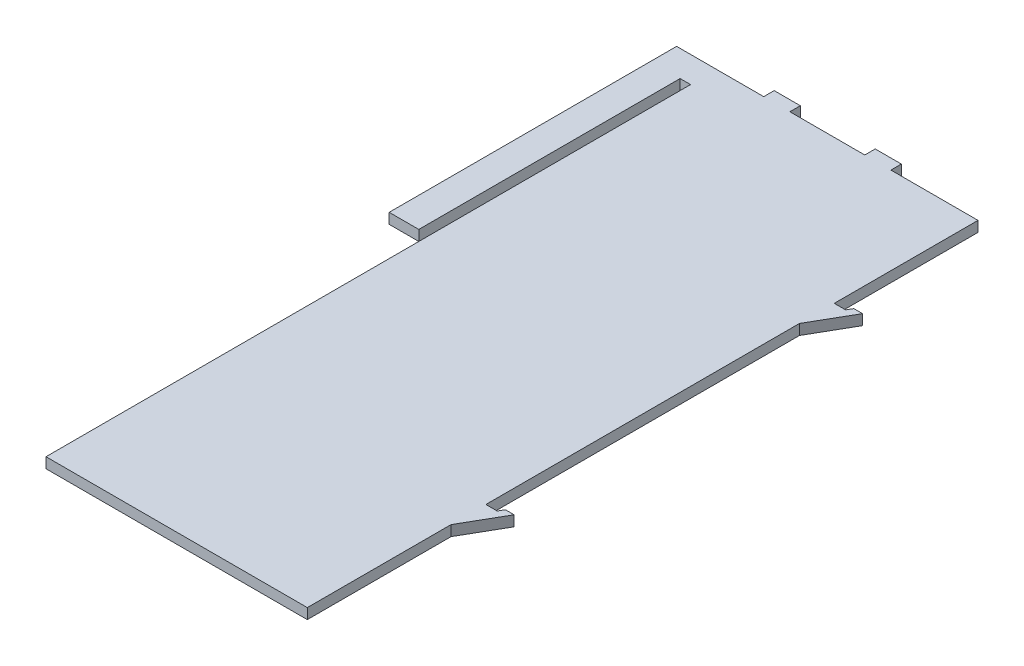
ISO-10303-21;
HEADER;
FILE_DESCRIPTION(('STEP AP214'),'2;1');
FILE_NAME('part.step','',(''),(''),'','','');
FILE_SCHEMA(('AUTOMOTIVE_DESIGN { 1 0 10303 214 1 1 1 1 }'));
ENDSEC;
DATA;
#1=APPLICATION_CONTEXT('core data for automotive mechanical design processes');
#2=APPLICATION_PROTOCOL_DEFINITION('international standard','automotive_design',2000,#1);
#3=PRODUCT_CONTEXT('',#1,'mechanical');
#4=PRODUCT('Part','Part','',(#3));
#5=PRODUCT_RELATED_PRODUCT_CATEGORY('part','',(#4));
#6=PRODUCT_DEFINITION_FORMATION('','',#4);
#7=PRODUCT_DEFINITION_CONTEXT('part definition',#1,'design');
#8=PRODUCT_DEFINITION('design','',#6,#7);
#9=PRODUCT_DEFINITION_SHAPE('','',#8);
#10=(LENGTH_UNIT() NAMED_UNIT(*) SI_UNIT(.MILLI.,.METRE.));
#11=(NAMED_UNIT(*) PLANE_ANGLE_UNIT() SI_UNIT($,.RADIAN.));
#12=(NAMED_UNIT(*) SI_UNIT($,.STERADIAN.) SOLID_ANGLE_UNIT());
#13=UNCERTAINTY_MEASURE_WITH_UNIT(LENGTH_MEASURE(1.E-05),#10,'distance_accuracy_value','');
#14=(GEOMETRIC_REPRESENTATION_CONTEXT(3) GLOBAL_UNCERTAINTY_ASSIGNED_CONTEXT((#13)) GLOBAL_UNIT_ASSIGNED_CONTEXT((#10,
#11,#12)) REPRESENTATION_CONTEXT('',''));
#15=CARTESIAN_POINT('',(0.,0.,0.));
#16=DIRECTION('',(0.,0.,1.));
#17=DIRECTION('',(1.,0.,0.));
#18=AXIS2_PLACEMENT_3D('',#15,#16,#17);
#19=CARTESIAN_POINT('',(0.,6.,0.));
#20=DIRECTION('',(0.,0.,-1.));
#21=DIRECTION('',(-1.,0.,0.));
#22=AXIS2_PLACEMENT_3D('',#19,#20,#21);
#23=PLANE('',#22);
#24=DIRECTION('',(1.,0.,0.));
#25=VECTOR('',#24,1.);
#26=CARTESIAN_POINT('',(0.,0.,0.));
#27=LINE('',#26,#25);
#28=CARTESIAN_POINT('',(0.,0.,0.));
#29=VERTEX_POINT('',#28);
#30=CARTESIAN_POINT('',(17.,0.,0.));
#31=VERTEX_POINT('',#30);
#32=EDGE_CURVE('E254',#29,#31,#27,.T.);
#33=ORIENTED_EDGE('',*,*,#32,.T.);
#34=DIRECTION('',(0.,-1.,0.));
#35=VECTOR('',#34,1.);
#36=CARTESIAN_POINT('',(17.,6.,0.));
#37=LINE('',#36,#35);
#38=CARTESIAN_POINT('',(17.,6.,0.));
#39=VERTEX_POINT('',#38);
#40=EDGE_CURVE('E11',#39,#31,#37,.T.);
#41=ORIENTED_EDGE('',*,*,#40,.F.);
#42=DIRECTION('',(1.,0.,0.));
#43=VECTOR('',#42,1.);
#44=CARTESIAN_POINT('',(0.,6.,0.));
#45=LINE('',#44,#43);
#46=CARTESIAN_POINT('',(0.,6.,0.));
#47=VERTEX_POINT('',#46);
#48=EDGE_CURVE('E330',#47,#39,#45,.T.);
#49=ORIENTED_EDGE('',*,*,#48,.F.);
#50=DIRECTION('',(0.,-1.,0.));
#51=VECTOR('',#50,1.);
#52=CARTESIAN_POINT('',(0.,6.,0.));
#53=LINE('',#52,#51);
#54=EDGE_CURVE('E250',#47,#29,#53,.T.);
#55=ORIENTED_EDGE('',*,*,#54,.T.);
#56=EDGE_LOOP('',(#33,#41,#49,#55));
#57=FACE_BOUND('',#56,.T.);
#58=ADVANCED_FACE('F45',(#57),#23,.F.);
#59=CARTESIAN_POINT('',(17.,6.,0.));
#60=DIRECTION('',(-1.,0.,0.));
#61=DIRECTION('',(0.,0.,1.));
#62=AXIS2_PLACEMENT_3D('',#59,#60,#61);
#63=PLANE('',#62);
#64=DIRECTION('',(0.,0.,-1.));
#65=VECTOR('',#64,1.);
#66=CARTESIAN_POINT('',(17.,0.,0.));
#67=LINE('',#66,#65);
#68=CARTESIAN_POINT('',(17.,0.,-150.));
#69=VERTEX_POINT('',#68);
#70=EDGE_CURVE('E258',#31,#69,#67,.T.);
#71=ORIENTED_EDGE('',*,*,#70,.T.);
#72=DIRECTION('',(0.,-1.,0.));
#73=VECTOR('',#72,1.);
#74=CARTESIAN_POINT('',(17.,6.,-150.));
#75=LINE('',#74,#73);
#76=CARTESIAN_POINT('',(17.,6.,-150.));
#77=VERTEX_POINT('',#76);
#78=EDGE_CURVE('E54',#77,#69,#75,.T.);
#79=ORIENTED_EDGE('',*,*,#78,.F.);
#80=DIRECTION('',(0.,0.,-1.));
#81=VECTOR('',#80,1.);
#82=CARTESIAN_POINT('',(17.,6.,0.));
#83=LINE('',#82,#81);
#84=EDGE_CURVE('E159',#39,#77,#83,.T.);
#85=ORIENTED_EDGE('',*,*,#84,.F.);
#86=ORIENTED_EDGE('',*,*,#40,.T.);
#87=EDGE_LOOP('',(#71,#79,#85,#86));
#88=FACE_BOUND('',#87,.T.);
#89=ADVANCED_FACE('F522',(#88),#63,.F.);
#90=CARTESIAN_POINT('',(17.,6.,-150.));
#91=DIRECTION('',(0.,0.,-1.));
#92=DIRECTION('',(-1.,0.,0.));
#93=AXIS2_PLACEMENT_3D('',#90,#91,#92);
#94=PLANE('',#93);
#95=DIRECTION('',(1.,0.,0.));
#96=VECTOR('',#95,1.);
#97=CARTESIAN_POINT('',(17.,0.,-150.));
#98=LINE('',#97,#96);
#99=CARTESIAN_POINT('',(23.,0.,-150.));
#100=VERTEX_POINT('',#99);
#101=EDGE_CURVE('E261',#69,#100,#98,.T.);
#102=ORIENTED_EDGE('',*,*,#101,.T.);
#103=DIRECTION('',(0.,-1.,0.));
#104=VECTOR('',#103,1.);
#105=CARTESIAN_POINT('',(23.,6.,-150.));
#106=LINE('',#105,#104);
#107=CARTESIAN_POINT('',(23.,6.,-150.));
#108=VERTEX_POINT('',#107);
#109=EDGE_CURVE('E413',#108,#100,#106,.T.);
#110=ORIENTED_EDGE('',*,*,#109,.F.);
#111=DIRECTION('',(1.,0.,0.));
#112=VECTOR('',#111,1.);
#113=CARTESIAN_POINT('',(17.,6.,-150.));
#114=LINE('',#113,#112);
#115=EDGE_CURVE('E423',#77,#108,#114,.T.);
#116=ORIENTED_EDGE('',*,*,#115,.F.);
#117=ORIENTED_EDGE('',*,*,#78,.T.);
#118=EDGE_LOOP('',(#102,#110,#116,#117));
#119=FACE_BOUND('',#118,.T.);
#120=ADVANCED_FACE('F421',(#119),#94,.F.);
#121=CARTESIAN_POINT('',(23.,6.,-150.));
#122=DIRECTION('',(1.,0.,0.));
#123=DIRECTION('',(0.,0.,-1.));
#124=AXIS2_PLACEMENT_3D('',#121,#122,#123);
#125=PLANE('',#124);
#126=DIRECTION('',(0.,0.,1.));
#127=VECTOR('',#126,1.);
#128=CARTESIAN_POINT('',(23.,0.,-150.));
#129=LINE('',#128,#127);
#130=CARTESIAN_POINT('',(23.,0.,220.));
#131=VERTEX_POINT('',#130);
#132=EDGE_CURVE('E264',#100,#131,#129,.T.);
#133=ORIENTED_EDGE('',*,*,#132,.T.);
#134=DIRECTION('',(0.,-1.,0.));
#135=VECTOR('',#134,1.);
#136=CARTESIAN_POINT('',(23.,6.,220.));
#137=LINE('',#136,#135);
#138=CARTESIAN_POINT('',(23.,6.,220.));
#139=VERTEX_POINT('',#138);
#140=EDGE_CURVE('E409',#139,#131,#137,.T.);
#141=ORIENTED_EDGE('',*,*,#140,.F.);
#142=DIRECTION('',(0.,0.,1.));
#143=VECTOR('',#142,1.);
#144=CARTESIAN_POINT('',(23.,6.,-150.));
#145=LINE('',#144,#143);
#146=EDGE_CURVE('E442',#108,#139,#145,.T.);
#147=ORIENTED_EDGE('',*,*,#146,.F.);
#148=ORIENTED_EDGE('',*,*,#109,.T.);
#149=EDGE_LOOP('',(#133,#141,#147,#148));
#150=FACE_BOUND('',#149,.T.);
#151=ADVANCED_FACE('F432',(#150),#125,.F.);
#152=CARTESIAN_POINT('',(173.,6.,220.));
#153=DIRECTION('',(0.,0.,-1.));
#154=DIRECTION('',(-1.,0.,0.));
#155=AXIS2_PLACEMENT_3D('',#152,#153,#154);
#156=PLANE('',#155);
#157=DIRECTION('',(1.,0.,0.));
#158=VECTOR('',#157,1.);
#159=CARTESIAN_POINT('',(173.,0.,220.));
#160=LINE('',#159,#158);
#161=CARTESIAN_POINT('',(173.,0.,220.));
#162=VERTEX_POINT('',#161);
#163=EDGE_CURVE('E267',#131,#162,#160,.T.);
#164=ORIENTED_EDGE('',*,*,#163,.T.);
#165=DIRECTION('',(0.,-1.,0.));
#166=VECTOR('',#165,1.);
#167=CARTESIAN_POINT('',(173.,6.,220.));
#168=LINE('',#167,#166);
#169=CARTESIAN_POINT('',(173.,6.,220.));
#170=VERTEX_POINT('',#169);
#171=EDGE_CURVE('E405',#170,#162,#168,.T.);
#172=ORIENTED_EDGE('',*,*,#171,.F.);
#173=DIRECTION('',(1.,0.,0.));
#174=VECTOR('',#173,1.);
#175=CARTESIAN_POINT('',(173.,6.,220.));
#176=LINE('',#175,#174);
#177=EDGE_CURVE('E438',#139,#170,#176,.T.);
#178=ORIENTED_EDGE('',*,*,#177,.F.);
#179=ORIENTED_EDGE('',*,*,#140,.T.);
#180=EDGE_LOOP('',(#164,#172,#178,#179));
#181=FACE_BOUND('',#180,.T.);
#182=ADVANCED_FACE('F436',(#181),#156,.F.);
#183=CARTESIAN_POINT('',(173.,6.,137.499999999999));
#184=DIRECTION('',(-1.,0.,0.));
#185=DIRECTION('',(0.,0.,1.));
#186=AXIS2_PLACEMENT_3D('',#183,#184,#185);
#187=PLANE('',#186);
#188=DIRECTION('',(0.,0.,-1.));
#189=VECTOR('',#188,1.);
#190=CARTESIAN_POINT('',(173.,0.,137.499999999999));
#191=LINE('',#190,#189);
#192=CARTESIAN_POINT('',(173.,0.,137.499999999999));
#193=VERTEX_POINT('',#192);
#194=EDGE_CURVE('E270',#162,#193,#191,.T.);
#195=ORIENTED_EDGE('',*,*,#194,.T.);
#196=DIRECTION('',(0.,-1.,0.));
#197=VECTOR('',#196,1.);
#198=CARTESIAN_POINT('',(173.,6.,137.499999999999));
#199=LINE('',#198,#197);
#200=CARTESIAN_POINT('',(173.,6.,137.499999999999));
#201=VERTEX_POINT('',#200);
#202=EDGE_CURVE('E401',#201,#193,#199,.T.);
#203=ORIENTED_EDGE('',*,*,#202,.F.);
#204=DIRECTION('',(0.,0.,-1.));
#205=VECTOR('',#204,1.);
#206=CARTESIAN_POINT('',(173.,6.,137.499999999999));
#207=LINE('',#206,#205);
#208=EDGE_CURVE('E441',#170,#201,#207,.T.);
#209=ORIENTED_EDGE('',*,*,#208,.F.);
#210=ORIENTED_EDGE('',*,*,#171,.T.);
#211=EDGE_LOOP('',(#195,#203,#209,#210));
#212=FACE_BOUND('',#211,.T.);
#213=ADVANCED_FACE('F535',(#212),#187,.F.);
#214=CARTESIAN_POINT('',(186.225,6.,114.499999999999));
#215=DIRECTION('',(-0.866906303057535,0.,-0.498471124258084));
#216=DIRECTION('',(-0.498471124258084,0.,0.866906303057535));
#217=AXIS2_PLACEMENT_3D('',#214,#215,#216);
#218=PLANE('',#217);
#219=DIRECTION('',(0.498471124258084,0.,-0.866906303057535));
#220=VECTOR('',#219,1.);
#221=CARTESIAN_POINT('',(186.225,0.,114.499999999999));
#222=LINE('',#221,#220);
#223=CARTESIAN_POINT('',(186.225,0.,114.499999999999));
#224=VERTEX_POINT('',#223);
#225=EDGE_CURVE('E273',#193,#224,#222,.T.);
#226=ORIENTED_EDGE('',*,*,#225,.T.);
#227=DIRECTION('',(0.,-1.,0.));
#228=VECTOR('',#227,1.);
#229=CARTESIAN_POINT('',(186.225,6.,114.499999999999));
#230=LINE('',#229,#228);
#231=CARTESIAN_POINT('',(186.225,6.,114.499999999999));
#232=VERTEX_POINT('',#231);
#233=EDGE_CURVE('E397',#232,#224,#230,.T.);
#234=ORIENTED_EDGE('',*,*,#233,.F.);
#235=DIRECTION('',(0.498471124258084,0.,-0.866906303057535));
#236=VECTOR('',#235,1.);
#237=CARTESIAN_POINT('',(186.225,6.,114.499999999999));
#238=LINE('',#237,#236);
#239=EDGE_CURVE('E446',#201,#232,#238,.T.);
#240=ORIENTED_EDGE('',*,*,#239,.F.);
#241=ORIENTED_EDGE('',*,*,#202,.T.);
#242=EDGE_LOOP('',(#226,#234,#240,#241));
#243=FACE_BOUND('',#242,.T.);
#244=ADVANCED_FACE('F538',(#243),#218,.F.);
#245=CARTESIAN_POINT('',(181.225,6.,114.499999999999));
#246=DIRECTION('',(0.,0.,1.));
#247=DIRECTION('',(1.,0.,0.));
#248=AXIS2_PLACEMENT_3D('',#245,#246,#247);
#249=PLANE('',#248);
#250=DIRECTION('',(-1.,0.,0.));
#251=VECTOR('',#250,1.);
#252=CARTESIAN_POINT('',(181.225,0.,114.499999999999));
#253=LINE('',#252,#251);
#254=CARTESIAN_POINT('',(181.225,0.,114.499999999999));
#255=VERTEX_POINT('',#254);
#256=EDGE_CURVE('E276',#224,#255,#253,.T.);
#257=ORIENTED_EDGE('',*,*,#256,.T.);
#258=DIRECTION('',(0.,-1.,0.));
#259=VECTOR('',#258,1.);
#260=CARTESIAN_POINT('',(181.225,6.,114.499999999999));
#261=LINE('',#260,#259);
#262=CARTESIAN_POINT('',(181.225,6.,114.499999999999));
#263=VERTEX_POINT('',#262);
#264=EDGE_CURVE('E393',#263,#255,#261,.T.);
#265=ORIENTED_EDGE('',*,*,#264,.F.);
#266=DIRECTION('',(-1.,0.,0.));
#267=VECTOR('',#266,1.);
#268=CARTESIAN_POINT('',(181.225,6.,114.499999999999));
#269=LINE('',#268,#267);
#270=EDGE_CURVE('E453',#232,#263,#269,.T.);
#271=ORIENTED_EDGE('',*,*,#270,.F.);
#272=ORIENTED_EDGE('',*,*,#233,.T.);
#273=EDGE_LOOP('',(#257,#265,#271,#272));
#274=FACE_BOUND('',#273,.T.);
#275=ADVANCED_FACE('F542',(#274),#249,.F.);
#276=CARTESIAN_POINT('',(179.5,6.,117.499999999999));
#277=DIRECTION('',(0.866906303057531,0.,0.49847112425809));
#278=DIRECTION('',(0.49847112425809,0.,-0.866906303057531));
#279=AXIS2_PLACEMENT_3D('',#276,#277,#278);
#280=PLANE('',#279);
#281=DIRECTION('',(-0.49847112425809,0.,0.866906303057531));
#282=VECTOR('',#281,1.);
#283=CARTESIAN_POINT('',(179.5,0.,117.499999999999));
#284=LINE('',#283,#282);
#285=CARTESIAN_POINT('',(179.5,0.,117.499999999999));
#286=VERTEX_POINT('',#285);
#287=EDGE_CURVE('E279',#255,#286,#284,.T.);
#288=ORIENTED_EDGE('',*,*,#287,.T.);
#289=DIRECTION('',(0.,-1.,0.));
#290=VECTOR('',#289,1.);
#291=CARTESIAN_POINT('',(179.5,6.,117.499999999999));
#292=LINE('',#291,#290);
#293=CARTESIAN_POINT('',(179.5,6.,117.499999999999));
#294=VERTEX_POINT('',#293);
#295=EDGE_CURVE('E389',#294,#286,#292,.T.);
#296=ORIENTED_EDGE('',*,*,#295,.F.);
#297=DIRECTION('',(-0.49847112425809,0.,0.866906303057531));
#298=VECTOR('',#297,1.);
#299=CARTESIAN_POINT('',(179.5,6.,117.499999999999));
#300=LINE('',#299,#298);
#301=EDGE_CURVE('E456',#263,#294,#300,.T.);
#302=ORIENTED_EDGE('',*,*,#301,.F.);
#303=ORIENTED_EDGE('',*,*,#264,.T.);
#304=EDGE_LOOP('',(#288,#296,#302,#303));
#305=FACE_BOUND('',#304,.T.);
#306=ADVANCED_FACE('F546',(#305),#280,.F.);
#307=CARTESIAN_POINT('',(173.,6.,117.499999999999));
#308=DIRECTION('',(0.,0.,1.));
#309=DIRECTION('',(1.,0.,0.));
#310=AXIS2_PLACEMENT_3D('',#307,#308,#309);
#311=PLANE('',#310);
#312=DIRECTION('',(-1.,0.,0.));
#313=VECTOR('',#312,1.);
#314=CARTESIAN_POINT('',(173.,0.,117.499999999999));
#315=LINE('',#314,#313);
#316=CARTESIAN_POINT('',(173.,0.,117.499999999999));
#317=VERTEX_POINT('',#316);
#318=EDGE_CURVE('E282',#286,#317,#315,.T.);
#319=ORIENTED_EDGE('',*,*,#318,.T.);
#320=DIRECTION('',(0.,-1.,0.));
#321=VECTOR('',#320,1.);
#322=CARTESIAN_POINT('',(173.,6.,117.499999999999));
#323=LINE('',#322,#321);
#324=CARTESIAN_POINT('',(173.,6.,117.499999999999));
#325=VERTEX_POINT('',#324);
#326=EDGE_CURVE('E385',#325,#317,#323,.T.);
#327=ORIENTED_EDGE('',*,*,#326,.F.);
#328=DIRECTION('',(-1.,0.,0.));
#329=VECTOR('',#328,1.);
#330=CARTESIAN_POINT('',(173.,6.,117.499999999999));
#331=LINE('',#330,#329);
#332=EDGE_CURVE('E459',#294,#325,#331,.T.);
#333=ORIENTED_EDGE('',*,*,#332,.F.);
#334=ORIENTED_EDGE('',*,*,#295,.T.);
#335=EDGE_LOOP('',(#319,#327,#333,#334));
#336=FACE_BOUND('',#335,.T.);
#337=ADVANCED_FACE('F550',(#336),#311,.F.);
#338=CARTESIAN_POINT('',(173.,6.,-62.5000000000046));
#339=DIRECTION('',(-1.,0.,0.));
#340=DIRECTION('',(0.,0.,1.));
#341=AXIS2_PLACEMENT_3D('',#338,#339,#340);
#342=PLANE('',#341);
#343=DIRECTION('',(0.,0.,-1.));
#344=VECTOR('',#343,1.);
#345=CARTESIAN_POINT('',(173.,0.,-62.5000000000046));
#346=LINE('',#345,#344);
#347=CARTESIAN_POINT('',(173.,0.,-62.5000000000046));
#348=VERTEX_POINT('',#347);
#349=EDGE_CURVE('E285',#317,#348,#346,.T.);
#350=ORIENTED_EDGE('',*,*,#349,.T.);
#351=DIRECTION('',(0.,-1.,0.));
#352=VECTOR('',#351,1.);
#353=CARTESIAN_POINT('',(173.,6.,-62.5000000000046));
#354=LINE('',#353,#352);
#355=CARTESIAN_POINT('',(173.,6.,-62.5000000000046));
#356=VERTEX_POINT('',#355);
#357=EDGE_CURVE('E381',#356,#348,#354,.T.);
#358=ORIENTED_EDGE('',*,*,#357,.F.);
#359=DIRECTION('',(0.,0.,-1.));
#360=VECTOR('',#359,1.);
#361=CARTESIAN_POINT('',(173.,6.,-62.5000000000046));
#362=LINE('',#361,#360);
#363=EDGE_CURVE('E462',#325,#356,#362,.T.);
#364=ORIENTED_EDGE('',*,*,#363,.F.);
#365=ORIENTED_EDGE('',*,*,#326,.T.);
#366=EDGE_LOOP('',(#350,#358,#364,#365));
#367=FACE_BOUND('',#366,.T.);
#368=ADVANCED_FACE('F554',(#367),#342,.F.);
#369=CARTESIAN_POINT('',(186.225,6.,-85.5000000000007));
#370=DIRECTION('',(-0.866906303057494,0.,-0.498471124258155));
#371=DIRECTION('',(-0.498471124258155,0.,0.866906303057494));
#372=AXIS2_PLACEMENT_3D('',#369,#370,#371);
#373=PLANE('',#372);
#374=DIRECTION('',(0.498471124258155,0.,-0.866906303057494));
#375=VECTOR('',#374,1.);
#376=CARTESIAN_POINT('',(186.225,0.,-85.5000000000007));
#377=LINE('',#376,#375);
#378=CARTESIAN_POINT('',(186.225,0.,-85.5000000000007));
#379=VERTEX_POINT('',#378);
#380=EDGE_CURVE('E288',#348,#379,#377,.T.);
#381=ORIENTED_EDGE('',*,*,#380,.T.);
#382=DIRECTION('',(0.,-1.,0.));
#383=VECTOR('',#382,1.);
#384=CARTESIAN_POINT('',(186.225,6.,-85.5000000000007));
#385=LINE('',#384,#383);
#386=CARTESIAN_POINT('',(186.225,6.,-85.5000000000007));
#387=VERTEX_POINT('',#386);
#388=EDGE_CURVE('E377',#387,#379,#385,.T.);
#389=ORIENTED_EDGE('',*,*,#388,.F.);
#390=DIRECTION('',(0.498471124258155,0.,-0.866906303057494));
#391=VECTOR('',#390,1.);
#392=CARTESIAN_POINT('',(186.225,6.,-85.5000000000007));
#393=LINE('',#392,#391);
#394=EDGE_CURVE('E465',#356,#387,#393,.T.);
#395=ORIENTED_EDGE('',*,*,#394,.F.);
#396=ORIENTED_EDGE('',*,*,#357,.T.);
#397=EDGE_LOOP('',(#381,#389,#395,#396));
#398=FACE_BOUND('',#397,.T.);
#399=ADVANCED_FACE('F558',(#398),#373,.F.);
#400=CARTESIAN_POINT('',(181.225,6.,-85.5000000000007));
#401=DIRECTION('',(0.,0.,1.));
#402=DIRECTION('',(1.,0.,0.));
#403=AXIS2_PLACEMENT_3D('',#400,#401,#402);
#404=PLANE('',#403);
#405=DIRECTION('',(-1.,0.,0.));
#406=VECTOR('',#405,1.);
#407=CARTESIAN_POINT('',(181.225,0.,-85.5000000000007));
#408=LINE('',#407,#406);
#409=CARTESIAN_POINT('',(181.225,0.,-85.5000000000007));
#410=VERTEX_POINT('',#409);
#411=EDGE_CURVE('E291',#379,#410,#408,.T.);
#412=ORIENTED_EDGE('',*,*,#411,.T.);
#413=DIRECTION('',(0.,-1.,0.));
#414=VECTOR('',#413,1.);
#415=CARTESIAN_POINT('',(181.225,6.,-85.5000000000007));
#416=LINE('',#415,#414);
#417=CARTESIAN_POINT('',(181.225,6.,-85.5000000000007));
#418=VERTEX_POINT('',#417);
#419=EDGE_CURVE('E373',#418,#410,#416,.T.);
#420=ORIENTED_EDGE('',*,*,#419,.F.);
#421=DIRECTION('',(-1.,0.,0.));
#422=VECTOR('',#421,1.);
#423=CARTESIAN_POINT('',(181.225,6.,-85.5000000000007));
#424=LINE('',#423,#422);
#425=EDGE_CURVE('E468',#387,#418,#424,.T.);
#426=ORIENTED_EDGE('',*,*,#425,.F.);
#427=ORIENTED_EDGE('',*,*,#388,.T.);
#428=EDGE_LOOP('',(#412,#420,#426,#427));
#429=FACE_BOUND('',#428,.T.);
#430=ADVANCED_FACE('F562',(#429),#404,.F.);
#431=CARTESIAN_POINT('',(179.5,6.,-82.5000000000007));
#432=DIRECTION('',(0.866906303057496,0.,0.498471124258151));
#433=DIRECTION('',(0.498471124258151,0.,-0.866906303057496));
#434=AXIS2_PLACEMENT_3D('',#431,#432,#433);
#435=PLANE('',#434);
#436=DIRECTION('',(-0.498471124258151,0.,0.866906303057496));
#437=VECTOR('',#436,1.);
#438=CARTESIAN_POINT('',(179.5,0.,-82.5000000000007));
#439=LINE('',#438,#437);
#440=CARTESIAN_POINT('',(179.5,0.,-82.5000000000007));
#441=VERTEX_POINT('',#440);
#442=EDGE_CURVE('E294',#410,#441,#439,.T.);
#443=ORIENTED_EDGE('',*,*,#442,.T.);
#444=DIRECTION('',(0.,-1.,0.));
#445=VECTOR('',#444,1.);
#446=CARTESIAN_POINT('',(179.5,6.,-82.5000000000007));
#447=LINE('',#446,#445);
#448=CARTESIAN_POINT('',(179.5,6.,-82.5000000000007));
#449=VERTEX_POINT('',#448);
#450=EDGE_CURVE('E369',#449,#441,#447,.T.);
#451=ORIENTED_EDGE('',*,*,#450,.F.);
#452=DIRECTION('',(-0.498471124258151,0.,0.866906303057496));
#453=VECTOR('',#452,1.);
#454=CARTESIAN_POINT('',(179.5,6.,-82.5000000000007));
#455=LINE('',#454,#453);
#456=EDGE_CURVE('E471',#418,#449,#455,.T.);
#457=ORIENTED_EDGE('',*,*,#456,.F.);
#458=ORIENTED_EDGE('',*,*,#419,.T.);
#459=EDGE_LOOP('',(#443,#451,#457,#458));
#460=FACE_BOUND('',#459,.T.);
#461=ADVANCED_FACE('F566',(#460),#435,.F.);
#462=CARTESIAN_POINT('',(173.,6.,-82.5000000000007));
#463=DIRECTION('',(0.,0.,1.));
#464=DIRECTION('',(1.,0.,0.));
#465=AXIS2_PLACEMENT_3D('',#462,#463,#464);
#466=PLANE('',#465);
#467=DIRECTION('',(-1.,0.,0.));
#468=VECTOR('',#467,1.);
#469=CARTESIAN_POINT('',(173.,0.,-82.5000000000007));
#470=LINE('',#469,#468);
#471=CARTESIAN_POINT('',(173.,0.,-82.5000000000007));
#472=VERTEX_POINT('',#471);
#473=EDGE_CURVE('E297',#441,#472,#470,.T.);
#474=ORIENTED_EDGE('',*,*,#473,.T.);
#475=DIRECTION('',(0.,-1.,0.));
#476=VECTOR('',#475,1.);
#477=CARTESIAN_POINT('',(173.,6.,-82.5000000000007));
#478=LINE('',#477,#476);
#479=CARTESIAN_POINT('',(173.,6.,-82.5000000000007));
#480=VERTEX_POINT('',#479);
#481=EDGE_CURVE('E365',#480,#472,#478,.T.);
#482=ORIENTED_EDGE('',*,*,#481,.F.);
#483=DIRECTION('',(-1.,0.,0.));
#484=VECTOR('',#483,1.);
#485=CARTESIAN_POINT('',(173.,6.,-82.5000000000007));
#486=LINE('',#485,#484);
#487=EDGE_CURVE('E474',#449,#480,#486,.T.);
#488=ORIENTED_EDGE('',*,*,#487,.F.);
#489=ORIENTED_EDGE('',*,*,#450,.T.);
#490=EDGE_LOOP('',(#474,#482,#488,#489));
#491=FACE_BOUND('',#490,.T.);
#492=ADVANCED_FACE('F570',(#491),#466,.F.);
#493=CARTESIAN_POINT('',(173.,6.,-165.000000000001));
#494=DIRECTION('',(-1.,0.,0.));
#495=DIRECTION('',(0.,0.,1.));
#496=AXIS2_PLACEMENT_3D('',#493,#494,#495);
#497=PLANE('',#496);
#498=DIRECTION('',(0.,0.,-1.));
#499=VECTOR('',#498,1.);
#500=CARTESIAN_POINT('',(173.,0.,-165.000000000001));
#501=LINE('',#500,#499);
#502=CARTESIAN_POINT('',(173.,0.,-165.000000000001));
#503=VERTEX_POINT('',#502);
#504=EDGE_CURVE('E300',#472,#503,#501,.T.);
#505=ORIENTED_EDGE('',*,*,#504,.T.);
#506=DIRECTION('',(0.,-1.,0.));
#507=VECTOR('',#506,1.);
#508=CARTESIAN_POINT('',(173.,6.,-165.000000000001));
#509=LINE('',#508,#507);
#510=CARTESIAN_POINT('',(173.,6.,-165.000000000001));
#511=VERTEX_POINT('',#510);
#512=EDGE_CURVE('E361',#511,#503,#509,.T.);
#513=ORIENTED_EDGE('',*,*,#512,.F.);
#514=DIRECTION('',(0.,0.,-1.));
#515=VECTOR('',#514,1.);
#516=CARTESIAN_POINT('',(173.,6.,-165.000000000001));
#517=LINE('',#516,#515);
#518=EDGE_CURVE('E477',#480,#511,#517,.T.);
#519=ORIENTED_EDGE('',*,*,#518,.F.);
#520=ORIENTED_EDGE('',*,*,#481,.T.);
#521=EDGE_LOOP('',(#505,#513,#519,#520));
#522=FACE_BOUND('',#521,.T.);
#523=ADVANCED_FACE('F574',(#522),#497,.F.);
#524=CARTESIAN_POINT('',(123.,6.,-165.000000000001));
#525=DIRECTION('',(0.,0.,1.));
#526=DIRECTION('',(1.,0.,0.));
#527=AXIS2_PLACEMENT_3D('',#524,#525,#526);
#528=PLANE('',#527);
#529=DIRECTION('',(-1.,0.,0.));
#530=VECTOR('',#529,1.);
#531=CARTESIAN_POINT('',(123.,0.,-165.000000000001));
#532=LINE('',#531,#530);
#533=CARTESIAN_POINT('',(123.,0.,-165.000000000001));
#534=VERTEX_POINT('',#533);
#535=EDGE_CURVE('E303',#503,#534,#532,.T.);
#536=ORIENTED_EDGE('',*,*,#535,.T.);
#537=DIRECTION('',(0.,-1.,0.));
#538=VECTOR('',#537,1.);
#539=CARTESIAN_POINT('',(123.,6.,-165.000000000001));
#540=LINE('',#539,#538);
#541=CARTESIAN_POINT('',(123.,6.,-165.000000000001));
#542=VERTEX_POINT('',#541);
#543=EDGE_CURVE('E357',#542,#534,#540,.T.);
#544=ORIENTED_EDGE('',*,*,#543,.F.);
#545=DIRECTION('',(-1.,0.,0.));
#546=VECTOR('',#545,1.);
#547=CARTESIAN_POINT('',(123.,6.,-165.000000000001));
#548=LINE('',#547,#546);
#549=EDGE_CURVE('E480',#511,#542,#548,.T.);
#550=ORIENTED_EDGE('',*,*,#549,.F.);
#551=ORIENTED_EDGE('',*,*,#512,.T.);
#552=EDGE_LOOP('',(#536,#544,#550,#551));
#553=FACE_BOUND('',#552,.T.);
#554=ADVANCED_FACE('F578',(#553),#528,.F.);
#555=CARTESIAN_POINT('',(123.,6.,-171.000000000001));
#556=DIRECTION('',(-1.,0.,0.));
#557=DIRECTION('',(0.,0.,1.));
#558=AXIS2_PLACEMENT_3D('',#555,#556,#557);
#559=PLANE('',#558);
#560=DIRECTION('',(0.,0.,-1.));
#561=VECTOR('',#560,1.);
#562=CARTESIAN_POINT('',(123.,0.,-171.000000000001));
#563=LINE('',#562,#561);
#564=CARTESIAN_POINT('',(123.,0.,-171.000000000001));
#565=VERTEX_POINT('',#564);
#566=EDGE_CURVE('E306',#534,#565,#563,.T.);
#567=ORIENTED_EDGE('',*,*,#566,.T.);
#568=DIRECTION('',(0.,-1.,0.));
#569=VECTOR('',#568,1.);
#570=CARTESIAN_POINT('',(123.,6.,-171.000000000001));
#571=LINE('',#570,#569);
#572=CARTESIAN_POINT('',(123.,6.,-171.000000000001));
#573=VERTEX_POINT('',#572);
#574=EDGE_CURVE('E353',#573,#565,#571,.T.);
#575=ORIENTED_EDGE('',*,*,#574,.F.);
#576=DIRECTION('',(0.,0.,-1.));
#577=VECTOR('',#576,1.);
#578=CARTESIAN_POINT('',(123.,6.,-171.000000000001));
#579=LINE('',#578,#577);
#580=EDGE_CURVE('E483',#542,#573,#579,.T.);
#581=ORIENTED_EDGE('',*,*,#580,.F.);
#582=ORIENTED_EDGE('',*,*,#543,.T.);
#583=EDGE_LOOP('',(#567,#575,#581,#582));
#584=FACE_BOUND('',#583,.T.);
#585=ADVANCED_FACE('F582',(#584),#559,.F.);
#586=CARTESIAN_POINT('',(108.,6.,-171.000000000001));
#587=DIRECTION('',(0.,0.,1.));
#588=DIRECTION('',(1.,0.,0.));
#589=AXIS2_PLACEMENT_3D('',#586,#587,#588);
#590=PLANE('',#589);
#591=DIRECTION('',(-1.,0.,0.));
#592=VECTOR('',#591,1.);
#593=CARTESIAN_POINT('',(108.,0.,-171.000000000001));
#594=LINE('',#593,#592);
#595=CARTESIAN_POINT('',(108.,0.,-171.000000000001));
#596=VERTEX_POINT('',#595);
#597=EDGE_CURVE('E309',#565,#596,#594,.T.);
#598=ORIENTED_EDGE('',*,*,#597,.T.);
#599=DIRECTION('',(0.,-1.,0.));
#600=VECTOR('',#599,1.);
#601=CARTESIAN_POINT('',(108.,6.,-171.000000000001));
#602=LINE('',#601,#600);
#603=CARTESIAN_POINT('',(108.,6.,-171.000000000001));
#604=VERTEX_POINT('',#603);
#605=EDGE_CURVE('E349',#604,#596,#602,.T.);
#606=ORIENTED_EDGE('',*,*,#605,.F.);
#607=DIRECTION('',(-1.,0.,0.));
#608=VECTOR('',#607,1.);
#609=CARTESIAN_POINT('',(108.,6.,-171.000000000001));
#610=LINE('',#609,#608);
#611=EDGE_CURVE('E486',#573,#604,#610,.T.);
#612=ORIENTED_EDGE('',*,*,#611,.F.);
#613=ORIENTED_EDGE('',*,*,#574,.T.);
#614=EDGE_LOOP('',(#598,#606,#612,#613));
#615=FACE_BOUND('',#614,.T.);
#616=ADVANCED_FACE('F586',(#615),#590,.F.);
#617=CARTESIAN_POINT('',(108.,6.,-165.000000000001));
#618=DIRECTION('',(1.,0.,0.));
#619=DIRECTION('',(0.,0.,-1.));
#620=AXIS2_PLACEMENT_3D('',#617,#618,#619);
#621=PLANE('',#620);
#622=DIRECTION('',(0.,0.,1.));
#623=VECTOR('',#622,1.);
#624=CARTESIAN_POINT('',(108.,0.,-165.000000000001));
#625=LINE('',#624,#623);
#626=CARTESIAN_POINT('',(108.,0.,-165.000000000001));
#627=VERTEX_POINT('',#626);
#628=EDGE_CURVE('E312',#596,#627,#625,.T.);
#629=ORIENTED_EDGE('',*,*,#628,.T.);
#630=DIRECTION('',(0.,-1.,0.));
#631=VECTOR('',#630,1.);
#632=CARTESIAN_POINT('',(108.,6.,-165.000000000001));
#633=LINE('',#632,#631);
#634=CARTESIAN_POINT('',(108.,6.,-165.000000000001));
#635=VERTEX_POINT('',#634);
#636=EDGE_CURVE('E345',#635,#627,#633,.T.);
#637=ORIENTED_EDGE('',*,*,#636,.F.);
#638=DIRECTION('',(0.,0.,1.));
#639=VECTOR('',#638,1.);
#640=CARTESIAN_POINT('',(108.,6.,-165.000000000001));
#641=LINE('',#640,#639);
#642=EDGE_CURVE('E489',#604,#635,#641,.T.);
#643=ORIENTED_EDGE('',*,*,#642,.F.);
#644=ORIENTED_EDGE('',*,*,#605,.T.);
#645=EDGE_LOOP('',(#629,#637,#643,#644));
#646=FACE_BOUND('',#645,.T.);
#647=ADVANCED_FACE('F590',(#646),#621,.F.);
#648=CARTESIAN_POINT('',(65.,6.,-165.000000000001));
#649=DIRECTION('',(0.,0.,1.));
#650=DIRECTION('',(1.,0.,0.));
#651=AXIS2_PLACEMENT_3D('',#648,#649,#650);
#652=PLANE('',#651);
#653=DIRECTION('',(-1.,0.,0.));
#654=VECTOR('',#653,1.);
#655=CARTESIAN_POINT('',(65.,0.,-165.000000000001));
#656=LINE('',#655,#654);
#657=CARTESIAN_POINT('',(65.,0.,-165.000000000001));
#658=VERTEX_POINT('',#657);
#659=EDGE_CURVE('E315',#627,#658,#656,.T.);
#660=ORIENTED_EDGE('',*,*,#659,.T.);
#661=DIRECTION('',(0.,-1.,0.));
#662=VECTOR('',#661,1.);
#663=CARTESIAN_POINT('',(65.,6.,-165.000000000001));
#664=LINE('',#663,#662);
#665=CARTESIAN_POINT('',(65.,6.,-165.000000000001));
#666=VERTEX_POINT('',#665);
#667=EDGE_CURVE('E341',#666,#658,#664,.T.);
#668=ORIENTED_EDGE('',*,*,#667,.F.);
#669=DIRECTION('',(-1.,0.,0.));
#670=VECTOR('',#669,1.);
#671=CARTESIAN_POINT('',(65.,6.,-165.000000000001));
#672=LINE('',#671,#670);
#673=EDGE_CURVE('E492',#635,#666,#672,.T.);
#674=ORIENTED_EDGE('',*,*,#673,.F.);
#675=ORIENTED_EDGE('',*,*,#636,.T.);
#676=EDGE_LOOP('',(#660,#668,#674,#675));
#677=FACE_BOUND('',#676,.T.);
#678=ADVANCED_FACE('F594',(#677),#652,.F.);
#679=CARTESIAN_POINT('',(65.,6.,-171.000000000001));
#680=DIRECTION('',(-1.,0.,0.));
#681=DIRECTION('',(0.,0.,1.));
#682=AXIS2_PLACEMENT_3D('',#679,#680,#681);
#683=PLANE('',#682);
#684=DIRECTION('',(0.,0.,-1.));
#685=VECTOR('',#684,1.);
#686=CARTESIAN_POINT('',(65.,0.,-171.000000000001));
#687=LINE('',#686,#685);
#688=CARTESIAN_POINT('',(65.,0.,-171.000000000001));
#689=VERTEX_POINT('',#688);
#690=EDGE_CURVE('E318',#658,#689,#687,.T.);
#691=ORIENTED_EDGE('',*,*,#690,.T.);
#692=DIRECTION('',(0.,-1.,0.));
#693=VECTOR('',#692,1.);
#694=CARTESIAN_POINT('',(65.,6.,-171.000000000001));
#695=LINE('',#694,#693);
#696=CARTESIAN_POINT('',(65.,6.,-171.000000000001));
#697=VERTEX_POINT('',#696);
#698=EDGE_CURVE('E337',#697,#689,#695,.T.);
#699=ORIENTED_EDGE('',*,*,#698,.F.);
#700=DIRECTION('',(0.,0.,-1.));
#701=VECTOR('',#700,1.);
#702=CARTESIAN_POINT('',(65.,6.,-171.000000000001));
#703=LINE('',#702,#701);
#704=EDGE_CURVE('E495',#666,#697,#703,.T.);
#705=ORIENTED_EDGE('',*,*,#704,.F.);
#706=ORIENTED_EDGE('',*,*,#667,.T.);
#707=EDGE_LOOP('',(#691,#699,#705,#706));
#708=FACE_BOUND('',#707,.T.);
#709=ADVANCED_FACE('F503',(#708),#683,.F.);
#710=CARTESIAN_POINT('',(65.,6.,-171.000000000001));
#711=DIRECTION('',(0.,0.,1.));
#712=DIRECTION('',(1.,0.,0.));
#713=AXIS2_PLACEMENT_3D('',#710,#711,#712);
#714=PLANE('',#713);
#715=DIRECTION('',(-1.,0.,0.));
#716=VECTOR('',#715,1.);
#717=CARTESIAN_POINT('',(65.,0.,-171.000000000001));
#718=LINE('',#717,#716);
#719=CARTESIAN_POINT('',(50.,0.,-171.000000000001));
#720=VERTEX_POINT('',#719);
#721=EDGE_CURVE('E321',#689,#720,#718,.T.);
#722=ORIENTED_EDGE('',*,*,#721,.T.);
#723=DIRECTION('',(0.,-1.,0.));
#724=VECTOR('',#723,1.);
#725=CARTESIAN_POINT('',(50.,6.,-171.000000000001));
#726=LINE('',#725,#724);
#727=CARTESIAN_POINT('',(50.,6.,-171.000000000001));
#728=VERTEX_POINT('',#727);
#729=EDGE_CURVE('E243',#728,#720,#726,.T.);
#730=ORIENTED_EDGE('',*,*,#729,.F.);
#731=DIRECTION('',(-1.,0.,0.));
#732=VECTOR('',#731,1.);
#733=CARTESIAN_POINT('',(65.,6.,-171.000000000001));
#734=LINE('',#733,#732);
#735=EDGE_CURVE('E232',#697,#728,#734,.T.);
#736=ORIENTED_EDGE('',*,*,#735,.F.);
#737=ORIENTED_EDGE('',*,*,#698,.T.);
#738=EDGE_LOOP('',(#722,#730,#736,#737));
#739=FACE_BOUND('',#738,.T.);
#740=ADVANCED_FACE('F507',(#739),#714,.F.);
#741=CARTESIAN_POINT('',(50.,6.,-171.000000000001));
#742=DIRECTION('',(1.,0.,0.));
#743=DIRECTION('',(0.,0.,-1.));
#744=AXIS2_PLACEMENT_3D('',#741,#742,#743);
#745=PLANE('',#744);
#746=DIRECTION('',(0.,0.,1.));
#747=VECTOR('',#746,1.);
#748=CARTESIAN_POINT('',(50.,0.,-171.000000000001));
#749=LINE('',#748,#747);
#750=CARTESIAN_POINT('',(50.,0.,-165.000000000001));
#751=VERTEX_POINT('',#750);
#752=EDGE_CURVE('E241',#720,#751,#749,.T.);
#753=ORIENTED_EDGE('',*,*,#752,.T.);
#754=DIRECTION('',(0.,-1.,0.));
#755=VECTOR('',#754,1.);
#756=CARTESIAN_POINT('',(50.,6.,-165.000000000001));
#757=LINE('',#756,#755);
#758=CARTESIAN_POINT('',(50.,6.,-165.000000000001));
#759=VERTEX_POINT('',#758);
#760=EDGE_CURVE('E238',#759,#751,#757,.T.);
#761=ORIENTED_EDGE('',*,*,#760,.F.);
#762=DIRECTION('',(0.,0.,1.));
#763=VECTOR('',#762,1.);
#764=CARTESIAN_POINT('',(50.,6.,-171.000000000001));
#765=LINE('',#764,#763);
#766=EDGE_CURVE('E226',#728,#759,#765,.T.);
#767=ORIENTED_EDGE('',*,*,#766,.F.);
#768=ORIENTED_EDGE('',*,*,#729,.T.);
#769=EDGE_LOOP('',(#753,#761,#767,#768));
#770=FACE_BOUND('',#769,.T.);
#771=ADVANCED_FACE('F239',(#770),#745,.F.);
#772=CARTESIAN_POINT('',(50.,6.,-165.000000000001));
#773=DIRECTION('',(0.,0.,1.));
#774=DIRECTION('',(1.,0.,0.));
#775=AXIS2_PLACEMENT_3D('',#772,#773,#774);
#776=PLANE('',#775);
#777=DIRECTION('',(-1.,0.,0.));
#778=VECTOR('',#777,1.);
#779=CARTESIAN_POINT('',(50.,0.,-165.000000000001));
#780=LINE('',#779,#778);
#781=CARTESIAN_POINT('',(0.,0.,-165.000000000001));
#782=VERTEX_POINT('',#781);
#783=EDGE_CURVE('E145',#751,#782,#780,.T.);
#784=ORIENTED_EDGE('',*,*,#783,.T.);
#785=DIRECTION('',(0.,-1.,0.));
#786=VECTOR('',#785,1.);
#787=CARTESIAN_POINT('',(0.,6.,-165.000000000001));
#788=LINE('',#787,#786);
#789=CARTESIAN_POINT('',(0.,6.,-165.000000000001));
#790=VERTEX_POINT('',#789);
#791=EDGE_CURVE('E244',#790,#782,#788,.T.);
#792=ORIENTED_EDGE('',*,*,#791,.F.);
#793=DIRECTION('',(-1.,0.,0.));
#794=VECTOR('',#793,1.);
#795=CARTESIAN_POINT('',(50.,6.,-165.000000000001));
#796=LINE('',#795,#794);
#797=EDGE_CURVE('E230',#759,#790,#796,.T.);
#798=ORIENTED_EDGE('',*,*,#797,.F.);
#799=ORIENTED_EDGE('',*,*,#760,.T.);
#800=EDGE_LOOP('',(#784,#792,#798,#799));
#801=FACE_BOUND('',#800,.T.);
#802=ADVANCED_FACE('F246',(#801),#776,.F.);
#803=CARTESIAN_POINT('',(0.,6.,0.));
#804=DIRECTION('',(1.,0.,0.));
#805=DIRECTION('',(0.,0.,-1.));
#806=AXIS2_PLACEMENT_3D('',#803,#804,#805);
#807=PLANE('',#806);
#808=DIRECTION('',(0.,0.,1.));
#809=VECTOR('',#808,1.);
#810=CARTESIAN_POINT('',(0.,0.,0.));
#811=LINE('',#810,#809);
#812=EDGE_CURVE('E151',#782,#29,#811,.T.);
#813=ORIENTED_EDGE('',*,*,#812,.T.);
#814=ORIENTED_EDGE('',*,*,#54,.F.);
#815=DIRECTION('',(0.,0.,1.));
#816=VECTOR('',#815,1.);
#817=CARTESIAN_POINT('',(0.,6.,0.));
#818=LINE('',#817,#816);
#819=EDGE_CURVE('E62',#790,#47,#818,.T.);
#820=ORIENTED_EDGE('',*,*,#819,.F.);
#821=ORIENTED_EDGE('',*,*,#791,.T.);
#822=EDGE_LOOP('',(#813,#814,#820,#821));
#823=FACE_BOUND('',#822,.T.);
#824=ADVANCED_FACE('F511',(#823),#807,.F.);
#825=CARTESIAN_POINT('',(0.,6.,0.));
#826=DIRECTION('',(0.,1.,0.));
#827=DIRECTION('',(0.,0.,1.));
#828=AXIS2_PLACEMENT_3D('',#825,#826,#827);
#829=PLANE('',#828);
#830=ORIENTED_EDGE('',*,*,#48,.T.);
#831=ORIENTED_EDGE('',*,*,#84,.T.);
#832=ORIENTED_EDGE('',*,*,#115,.T.);
#833=ORIENTED_EDGE('',*,*,#146,.T.);
#834=ORIENTED_EDGE('',*,*,#177,.T.);
#835=ORIENTED_EDGE('',*,*,#208,.T.);
#836=ORIENTED_EDGE('',*,*,#239,.T.);
#837=ORIENTED_EDGE('',*,*,#270,.T.);
#838=ORIENTED_EDGE('',*,*,#301,.T.);
#839=ORIENTED_EDGE('',*,*,#332,.T.);
#840=ORIENTED_EDGE('',*,*,#363,.T.);
#841=ORIENTED_EDGE('',*,*,#394,.T.);
#842=ORIENTED_EDGE('',*,*,#425,.T.);
#843=ORIENTED_EDGE('',*,*,#456,.T.);
#844=ORIENTED_EDGE('',*,*,#487,.T.);
#845=ORIENTED_EDGE('',*,*,#518,.T.);
#846=ORIENTED_EDGE('',*,*,#549,.T.);
#847=ORIENTED_EDGE('',*,*,#580,.T.);
#848=ORIENTED_EDGE('',*,*,#611,.T.);
#849=ORIENTED_EDGE('',*,*,#642,.T.);
#850=ORIENTED_EDGE('',*,*,#673,.T.);
#851=ORIENTED_EDGE('',*,*,#704,.T.);
#852=ORIENTED_EDGE('',*,*,#735,.T.);
#853=ORIENTED_EDGE('',*,*,#766,.T.);
#854=ORIENTED_EDGE('',*,*,#797,.T.);
#855=ORIENTED_EDGE('',*,*,#819,.T.);
#856=EDGE_LOOP('',(#830,#831,#832,#833,#834,#835,#836,#837,#838,#839,#840,#841,#842,#843,#844,
#845,#846,#847,#848,#849,#850,#851,#852,#853,#854,#855));
#857=FACE_BOUND('',#856,.T.);
#858=ADVANCED_FACE('F228',(#857),#829,.T.);
#859=CARTESIAN_POINT('',(0.,0.,0.));
#860=DIRECTION('',(0.,1.,0.));
#861=DIRECTION('',(0.,0.,1.));
#862=AXIS2_PLACEMENT_3D('',#859,#860,#861);
#863=PLANE('',#862);
#864=ORIENTED_EDGE('',*,*,#32,.F.);
#865=ORIENTED_EDGE('',*,*,#812,.F.);
#866=ORIENTED_EDGE('',*,*,#783,.F.);
#867=ORIENTED_EDGE('',*,*,#752,.F.);
#868=ORIENTED_EDGE('',*,*,#721,.F.);
#869=ORIENTED_EDGE('',*,*,#690,.F.);
#870=ORIENTED_EDGE('',*,*,#659,.F.);
#871=ORIENTED_EDGE('',*,*,#628,.F.);
#872=ORIENTED_EDGE('',*,*,#597,.F.);
#873=ORIENTED_EDGE('',*,*,#566,.F.);
#874=ORIENTED_EDGE('',*,*,#535,.F.);
#875=ORIENTED_EDGE('',*,*,#504,.F.);
#876=ORIENTED_EDGE('',*,*,#473,.F.);
#877=ORIENTED_EDGE('',*,*,#442,.F.);
#878=ORIENTED_EDGE('',*,*,#411,.F.);
#879=ORIENTED_EDGE('',*,*,#380,.F.);
#880=ORIENTED_EDGE('',*,*,#349,.F.);
#881=ORIENTED_EDGE('',*,*,#318,.F.);
#882=ORIENTED_EDGE('',*,*,#287,.F.);
#883=ORIENTED_EDGE('',*,*,#256,.F.);
#884=ORIENTED_EDGE('',*,*,#225,.F.);
#885=ORIENTED_EDGE('',*,*,#194,.F.);
#886=ORIENTED_EDGE('',*,*,#163,.F.);
#887=ORIENTED_EDGE('',*,*,#132,.F.);
#888=ORIENTED_EDGE('',*,*,#101,.F.);
#889=ORIENTED_EDGE('',*,*,#70,.F.);
#890=EDGE_LOOP('',(#864,#865,#866,#867,#868,#869,#870,#871,#872,#873,#874,#875,#876,#877,#878,
#879,#880,#881,#882,#883,#884,#885,#886,#887,#888,#889));
#891=FACE_BOUND('',#890,.T.);
#892=ADVANCED_FACE('F427',(#891),#863,.F.);
#893=CLOSED_SHELL('',(#58,#89,#120,#151,#182,#213,#244,#275,#306,#337,#368,#399,#430,#461,#492,
#523,#554,#585,#616,#647,#678,#709,#740,#771,#802,#824,#858,#892));
#894=MANIFOLD_SOLID_BREP('B2',#893);
#895=ADVANCED_BREP_SHAPE_REPRESENTATION('',(#18,#894),#14);
#896=SHAPE_DEFINITION_REPRESENTATION(#9,#895);
ENDSEC;
END-ISO-10303-21;
